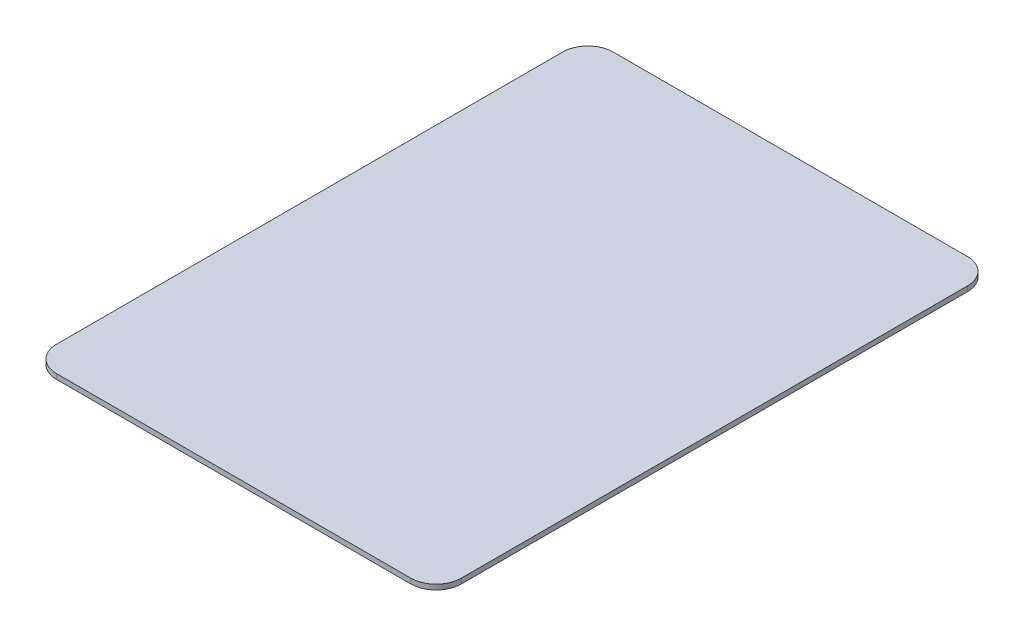
ISO-10303-21;
HEADER;
FILE_DESCRIPTION(('STEP AP214'),'2;1');
FILE_NAME('part.step','',(''),(''),'','','');
FILE_SCHEMA(('AUTOMOTIVE_DESIGN { 1 0 10303 214 1 1 1 1 }'));
ENDSEC;
DATA;
#1=APPLICATION_CONTEXT('core data for automotive mechanical design processes');
#2=APPLICATION_PROTOCOL_DEFINITION('international standard','automotive_design',2000,#1);
#3=PRODUCT_CONTEXT('',#1,'mechanical');
#4=PRODUCT('Part','Part','',(#3));
#5=PRODUCT_RELATED_PRODUCT_CATEGORY('part','',(#4));
#6=PRODUCT_DEFINITION_FORMATION('','',#4);
#7=PRODUCT_DEFINITION_CONTEXT('part definition',#1,'design');
#8=PRODUCT_DEFINITION('design','',#6,#7);
#9=PRODUCT_DEFINITION_SHAPE('','',#8);
#10=(LENGTH_UNIT() NAMED_UNIT(*) SI_UNIT(.MILLI.,.METRE.));
#11=(NAMED_UNIT(*) PLANE_ANGLE_UNIT() SI_UNIT($,.RADIAN.));
#12=(NAMED_UNIT(*) SI_UNIT($,.STERADIAN.) SOLID_ANGLE_UNIT());
#13=UNCERTAINTY_MEASURE_WITH_UNIT(LENGTH_MEASURE(1.E-05),#10,'distance_accuracy_value','');
#14=(GEOMETRIC_REPRESENTATION_CONTEXT(3) GLOBAL_UNCERTAINTY_ASSIGNED_CONTEXT((#13)) GLOBAL_UNIT_ASSIGNED_CONTEXT((#10,
#11,#12)) REPRESENTATION_CONTEXT('',''));
#15=CARTESIAN_POINT('',(0.,0.,0.));
#16=DIRECTION('',(0.,0.,1.));
#17=DIRECTION('',(1.,0.,0.));
#18=AXIS2_PLACEMENT_3D('',#15,#16,#17);
#19=CARTESIAN_POINT('',(254.,6.35,-349.25));
#20=DIRECTION('',(-1.,0.,0.));
#21=DIRECTION('',(0.,0.,1.));
#22=AXIS2_PLACEMENT_3D('',#19,#20,#21);
#23=PLANE('',#22);
#24=DIRECTION('',(0.,0.,-1.));
#25=VECTOR('',#24,1.);
#26=CARTESIAN_POINT('',(254.,6.35,-349.25));
#27=LINE('',#26,#25);
#28=CARTESIAN_POINT('',(254.,6.35,317.5));
#29=VERTEX_POINT('',#28);
#30=CARTESIAN_POINT('',(254.,6.35,-317.5));
#31=VERTEX_POINT('',#30);
#32=EDGE_CURVE('E142',#29,#31,#27,.T.);
#33=ORIENTED_EDGE('',*,*,#32,.F.);
#34=DIRECTION('',(0.,-1.,0.));
#35=VECTOR('',#34,1.);
#36=CARTESIAN_POINT('',(254.,6.35,317.5));
#37=LINE('',#36,#35);
#38=CARTESIAN_POINT('',(254.,0.,317.5));
#39=VERTEX_POINT('',#38);
#40=EDGE_CURVE('E11',#29,#39,#37,.T.);
#41=ORIENTED_EDGE('',*,*,#40,.T.);
#42=DIRECTION('',(0.,0.,-1.));
#43=VECTOR('',#42,1.);
#44=CARTESIAN_POINT('',(254.,0.,-349.25));
#45=LINE('',#44,#43);
#46=CARTESIAN_POINT('',(254.,0.,-317.5));
#47=VERTEX_POINT('',#46);
#48=EDGE_CURVE('E144',#39,#47,#45,.T.);
#49=ORIENTED_EDGE('',*,*,#48,.T.);
#50=DIRECTION('',(0.,-1.,0.));
#51=VECTOR('',#50,1.);
#52=CARTESIAN_POINT('',(254.,6.35,-317.5));
#53=LINE('',#52,#51);
#54=EDGE_CURVE('E50',#47,#31,#53,.F.);
#55=ORIENTED_EDGE('',*,*,#54,.T.);
#56=EDGE_LOOP('',(#33,#41,#49,#55));
#57=FACE_BOUND('',#56,.T.);
#58=ADVANCED_FACE('F41',(#57),#23,.F.);
#59=CARTESIAN_POINT('',(-254.,6.35,-349.25));
#60=DIRECTION('',(0.,0.,1.));
#61=DIRECTION('',(1.,0.,0.));
#62=AXIS2_PLACEMENT_3D('',#59,#60,#61);
#63=PLANE('',#62);
#64=DIRECTION('',(-1.,0.,0.));
#65=VECTOR('',#64,1.);
#66=CARTESIAN_POINT('',(-254.,0.,-349.25));
#67=LINE('',#66,#65);
#68=CARTESIAN_POINT('',(222.25,0.,-349.25));
#69=VERTEX_POINT('',#68);
#70=CARTESIAN_POINT('',(-222.25,0.,-349.25));
#71=VERTEX_POINT('',#70);
#72=EDGE_CURVE('E138',#69,#71,#67,.T.);
#73=ORIENTED_EDGE('',*,*,#72,.T.);
#74=DIRECTION('',(0.,-1.,0.));
#75=VECTOR('',#74,1.);
#76=CARTESIAN_POINT('',(-222.25,6.35,-349.25));
#77=LINE('',#76,#75);
#78=CARTESIAN_POINT('',(-222.25,6.35,-349.25));
#79=VERTEX_POINT('',#78);
#80=EDGE_CURVE('E114',#71,#79,#77,.F.);
#81=ORIENTED_EDGE('',*,*,#80,.T.);
#82=DIRECTION('',(-1.,0.,0.));
#83=VECTOR('',#82,1.);
#84=CARTESIAN_POINT('',(-254.,6.35,-349.25));
#85=LINE('',#84,#83);
#86=CARTESIAN_POINT('',(222.25,6.35,-349.25));
#87=VERTEX_POINT('',#86);
#88=EDGE_CURVE('E194',#87,#79,#85,.T.);
#89=ORIENTED_EDGE('',*,*,#88,.F.);
#90=DIRECTION('',(0.,-1.,0.));
#91=VECTOR('',#90,1.);
#92=CARTESIAN_POINT('',(222.25,6.35,-349.25));
#93=LINE('',#92,#91);
#94=EDGE_CURVE('E120',#87,#69,#93,.T.);
#95=ORIENTED_EDGE('',*,*,#94,.T.);
#96=EDGE_LOOP('',(#73,#81,#89,#95));
#97=FACE_BOUND('',#96,.T.);
#98=ADVANCED_FACE('F198',(#97),#63,.F.);
#99=CARTESIAN_POINT('',(-254.,6.35,-349.25));
#100=DIRECTION('',(1.,0.,0.));
#101=DIRECTION('',(0.,0.,-1.));
#102=AXIS2_PLACEMENT_3D('',#99,#100,#101);
#103=PLANE('',#102);
#104=DIRECTION('',(0.,0.,1.));
#105=VECTOR('',#104,1.);
#106=CARTESIAN_POINT('',(-254.,6.35,-349.25));
#107=LINE('',#106,#105);
#108=CARTESIAN_POINT('',(-254.,6.35,-317.5));
#109=VERTEX_POINT('',#108);
#110=CARTESIAN_POINT('',(-254.,6.35,317.5));
#111=VERTEX_POINT('',#110);
#112=EDGE_CURVE('E129',#109,#111,#107,.T.);
#113=ORIENTED_EDGE('',*,*,#112,.F.);
#114=DIRECTION('',(0.,-1.,0.));
#115=VECTOR('',#114,1.);
#116=CARTESIAN_POINT('',(-254.,6.35,-317.5));
#117=LINE('',#116,#115);
#118=CARTESIAN_POINT('',(-254.,0.,-317.5));
#119=VERTEX_POINT('',#118);
#120=EDGE_CURVE('E113',#109,#119,#117,.T.);
#121=ORIENTED_EDGE('',*,*,#120,.T.);
#122=DIRECTION('',(0.,0.,1.));
#123=VECTOR('',#122,1.);
#124=CARTESIAN_POINT('',(-254.,0.,-349.25));
#125=LINE('',#124,#123);
#126=CARTESIAN_POINT('',(-254.,0.,317.5));
#127=VERTEX_POINT('',#126);
#128=EDGE_CURVE('E127',#119,#127,#125,.T.);
#129=ORIENTED_EDGE('',*,*,#128,.T.);
#130=DIRECTION('',(0.,-1.,0.));
#131=VECTOR('',#130,1.);
#132=CARTESIAN_POINT('',(-254.,6.35,317.5));
#133=LINE('',#132,#131);
#134=EDGE_CURVE('E132',#127,#111,#133,.F.);
#135=ORIENTED_EDGE('',*,*,#134,.T.);
#136=EDGE_LOOP('',(#113,#121,#129,#135));
#137=FACE_BOUND('',#136,.T.);
#138=ADVANCED_FACE('F126',(#137),#103,.F.);
#139=CARTESIAN_POINT('',(-254.,6.35,349.25));
#140=DIRECTION('',(0.,0.,-1.));
#141=DIRECTION('',(-1.,0.,0.));
#142=AXIS2_PLACEMENT_3D('',#139,#140,#141);
#143=PLANE('',#142);
#144=DIRECTION('',(1.,0.,0.));
#145=VECTOR('',#144,1.);
#146=CARTESIAN_POINT('',(-254.,6.35,349.25));
#147=LINE('',#146,#145);
#148=CARTESIAN_POINT('',(-222.25,6.35,349.25));
#149=VERTEX_POINT('',#148);
#150=CARTESIAN_POINT('',(222.25,6.35,349.25));
#151=VERTEX_POINT('',#150);
#152=EDGE_CURVE('E149',#149,#151,#147,.T.);
#153=ORIENTED_EDGE('',*,*,#152,.F.);
#154=DIRECTION('',(0.,-1.,0.));
#155=VECTOR('',#154,1.);
#156=CARTESIAN_POINT('',(-222.25,6.35,349.25));
#157=LINE('',#156,#155);
#158=CARTESIAN_POINT('',(-222.25,0.,349.25));
#159=VERTEX_POINT('',#158);
#160=EDGE_CURVE('E176',#149,#159,#157,.T.);
#161=ORIENTED_EDGE('',*,*,#160,.T.);
#162=DIRECTION('',(1.,0.,0.));
#163=VECTOR('',#162,1.);
#164=CARTESIAN_POINT('',(-254.,0.,349.25));
#165=LINE('',#164,#163);
#166=CARTESIAN_POINT('',(222.25,0.,349.25));
#167=VERTEX_POINT('',#166);
#168=EDGE_CURVE('E137',#159,#167,#165,.T.);
#169=ORIENTED_EDGE('',*,*,#168,.T.);
#170=DIRECTION('',(0.,-1.,0.));
#171=VECTOR('',#170,1.);
#172=CARTESIAN_POINT('',(222.25,6.35,349.25));
#173=LINE('',#172,#171);
#174=EDGE_CURVE('E57',#167,#151,#173,.F.);
#175=ORIENTED_EDGE('',*,*,#174,.T.);
#176=EDGE_LOOP('',(#153,#161,#169,#175));
#177=FACE_BOUND('',#176,.T.);
#178=ADVANCED_FACE('F209',(#177),#143,.F.);
#179=CARTESIAN_POINT('',(0.,6.35,0.));
#180=DIRECTION('',(0.,1.,0.));
#181=DIRECTION('',(0.,0.,1.));
#182=AXIS2_PLACEMENT_3D('',#179,#180,#181);
#183=PLANE('',#182);
#184=ORIENTED_EDGE('',*,*,#88,.T.);
#185=CARTESIAN_POINT('',(-222.25,6.35,-317.5));
#186=DIRECTION('',(0.,1.,0.));
#187=DIRECTION('',(0.,0.,1.));
#188=AXIS2_PLACEMENT_3D('',#185,#186,#187);
#189=CIRCLE('',#188,31.75);
#190=EDGE_CURVE('E171',#79,#109,#189,.T.);
#191=ORIENTED_EDGE('',*,*,#190,.T.);
#192=ORIENTED_EDGE('',*,*,#112,.T.);
#193=CARTESIAN_POINT('',(-222.25,6.35,317.5));
#194=DIRECTION('',(0.,1.,0.));
#195=DIRECTION('',(0.,0.,1.));
#196=AXIS2_PLACEMENT_3D('',#193,#194,#195);
#197=CIRCLE('',#196,31.75);
#198=EDGE_CURVE('E64',#111,#149,#197,.T.);
#199=ORIENTED_EDGE('',*,*,#198,.T.);
#200=ORIENTED_EDGE('',*,*,#152,.T.);
#201=CARTESIAN_POINT('',(222.25,6.35,317.5));
#202=DIRECTION('',(0.,1.,0.));
#203=DIRECTION('',(0.,0.,1.));
#204=AXIS2_PLACEMENT_3D('',#201,#202,#203);
#205=CIRCLE('',#204,31.75);
#206=EDGE_CURVE('E166',#151,#29,#205,.T.);
#207=ORIENTED_EDGE('',*,*,#206,.T.);
#208=ORIENTED_EDGE('',*,*,#32,.T.);
#209=CARTESIAN_POINT('',(222.25,6.35,-317.5));
#210=DIRECTION('',(0.,1.,0.));
#211=DIRECTION('',(0.,0.,1.));
#212=AXIS2_PLACEMENT_3D('',#209,#210,#211);
#213=CIRCLE('',#212,31.75);
#214=EDGE_CURVE('E163',#31,#87,#213,.T.);
#215=ORIENTED_EDGE('',*,*,#214,.T.);
#216=EDGE_LOOP('',(#184,#191,#192,#199,#200,#207,#208,#215));
#217=FACE_BOUND('',#216,.T.);
#218=ADVANCED_FACE('F190',(#217),#183,.T.);
#219=CARTESIAN_POINT('',(0.,0.,0.));
#220=DIRECTION('',(0.,1.,0.));
#221=DIRECTION('',(0.,0.,1.));
#222=AXIS2_PLACEMENT_3D('',#219,#220,#221);
#223=PLANE('',#222);
#224=ORIENTED_EDGE('',*,*,#128,.F.);
#225=CARTESIAN_POINT('',(-222.25,0.,-317.5));
#226=DIRECTION('',(0.,1.,0.));
#227=DIRECTION('',(0.,0.,1.));
#228=AXIS2_PLACEMENT_3D('',#225,#226,#227);
#229=CIRCLE('',#228,31.75);
#230=EDGE_CURVE('E109',#119,#71,#229,.F.);
#231=ORIENTED_EDGE('',*,*,#230,.T.);
#232=ORIENTED_EDGE('',*,*,#72,.F.);
#233=CARTESIAN_POINT('',(222.25,0.,-317.5));
#234=DIRECTION('',(0.,1.,0.));
#235=DIRECTION('',(0.,0.,1.));
#236=AXIS2_PLACEMENT_3D('',#233,#234,#235);
#237=CIRCLE('',#236,31.75);
#238=EDGE_CURVE('E131',#69,#47,#237,.F.);
#239=ORIENTED_EDGE('',*,*,#238,.T.);
#240=ORIENTED_EDGE('',*,*,#48,.F.);
#241=CARTESIAN_POINT('',(222.25,0.,317.5));
#242=DIRECTION('',(0.,1.,0.));
#243=DIRECTION('',(0.,0.,1.));
#244=AXIS2_PLACEMENT_3D('',#241,#242,#243);
#245=CIRCLE('',#244,31.75);
#246=EDGE_CURVE('E153',#39,#167,#245,.F.);
#247=ORIENTED_EDGE('',*,*,#246,.T.);
#248=ORIENTED_EDGE('',*,*,#168,.F.);
#249=CARTESIAN_POINT('',(-222.25,0.,317.5));
#250=DIRECTION('',(0.,1.,0.));
#251=DIRECTION('',(0.,0.,1.));
#252=AXIS2_PLACEMENT_3D('',#249,#250,#251);
#253=CIRCLE('',#252,31.75);
#254=EDGE_CURVE('E121',#159,#127,#253,.F.);
#255=ORIENTED_EDGE('',*,*,#254,.T.);
#256=EDGE_LOOP('',(#224,#231,#232,#239,#240,#247,#248,#255));
#257=FACE_BOUND('',#256,.T.);
#258=ADVANCED_FACE('F134',(#257),#223,.F.);
#259=CARTESIAN_POINT('',(-222.25,6.35,-317.5));
#260=DIRECTION('',(0.,-1.,0.));
#261=DIRECTION('',(0.,0.,-1.));
#262=AXIS2_PLACEMENT_3D('',#259,#260,#261);
#263=CYLINDRICAL_SURFACE('',#262,31.75);
#264=ORIENTED_EDGE('',*,*,#190,.F.);
#265=ORIENTED_EDGE('',*,*,#80,.F.);
#266=ORIENTED_EDGE('',*,*,#230,.F.);
#267=ORIENTED_EDGE('',*,*,#120,.F.);
#268=EDGE_LOOP('',(#264,#265,#266,#267));
#269=FACE_BOUND('',#268,.T.);
#270=ADVANCED_FACE('F112',(#269),#263,.T.);
#271=CARTESIAN_POINT('',(-222.25,6.35,317.5));
#272=DIRECTION('',(0.,-1.,0.));
#273=DIRECTION('',(0.,0.,-1.));
#274=AXIS2_PLACEMENT_3D('',#271,#272,#273);
#275=CYLINDRICAL_SURFACE('',#274,31.75);
#276=ORIENTED_EDGE('',*,*,#198,.F.);
#277=ORIENTED_EDGE('',*,*,#134,.F.);
#278=ORIENTED_EDGE('',*,*,#254,.F.);
#279=ORIENTED_EDGE('',*,*,#160,.F.);
#280=EDGE_LOOP('',(#276,#277,#278,#279));
#281=FACE_BOUND('',#280,.T.);
#282=ADVANCED_FACE('F208',(#281),#275,.T.);
#283=CARTESIAN_POINT('',(222.25,6.35,317.5));
#284=DIRECTION('',(0.,-1.,0.));
#285=DIRECTION('',(0.,0.,-1.));
#286=AXIS2_PLACEMENT_3D('',#283,#284,#285);
#287=CYLINDRICAL_SURFACE('',#286,31.75);
#288=ORIENTED_EDGE('',*,*,#206,.F.);
#289=ORIENTED_EDGE('',*,*,#174,.F.);
#290=ORIENTED_EDGE('',*,*,#246,.F.);
#291=ORIENTED_EDGE('',*,*,#40,.F.);
#292=EDGE_LOOP('',(#288,#289,#290,#291));
#293=FACE_BOUND('',#292,.T.);
#294=ADVANCED_FACE('F211',(#293),#287,.T.);
#295=CARTESIAN_POINT('',(222.25,6.35,-317.5));
#296=DIRECTION('',(0.,-1.,0.));
#297=DIRECTION('',(0.,0.,-1.));
#298=AXIS2_PLACEMENT_3D('',#295,#296,#297);
#299=CYLINDRICAL_SURFACE('',#298,31.75);
#300=ORIENTED_EDGE('',*,*,#214,.F.);
#301=ORIENTED_EDGE('',*,*,#54,.F.);
#302=ORIENTED_EDGE('',*,*,#238,.F.);
#303=ORIENTED_EDGE('',*,*,#94,.F.);
#304=EDGE_LOOP('',(#300,#301,#302,#303));
#305=FACE_BOUND('',#304,.T.);
#306=ADVANCED_FACE('F43',(#305),#299,.T.);
#307=CLOSED_SHELL('',(#58,#98,#138,#178,#218,#258,#270,#282,#294,#306));
#308=MANIFOLD_SOLID_BREP('B2',#307);
#309=ADVANCED_BREP_SHAPE_REPRESENTATION('',(#18,#308),#14);
#310=SHAPE_DEFINITION_REPRESENTATION(#9,#309);
ENDSEC;
END-ISO-10303-21;
